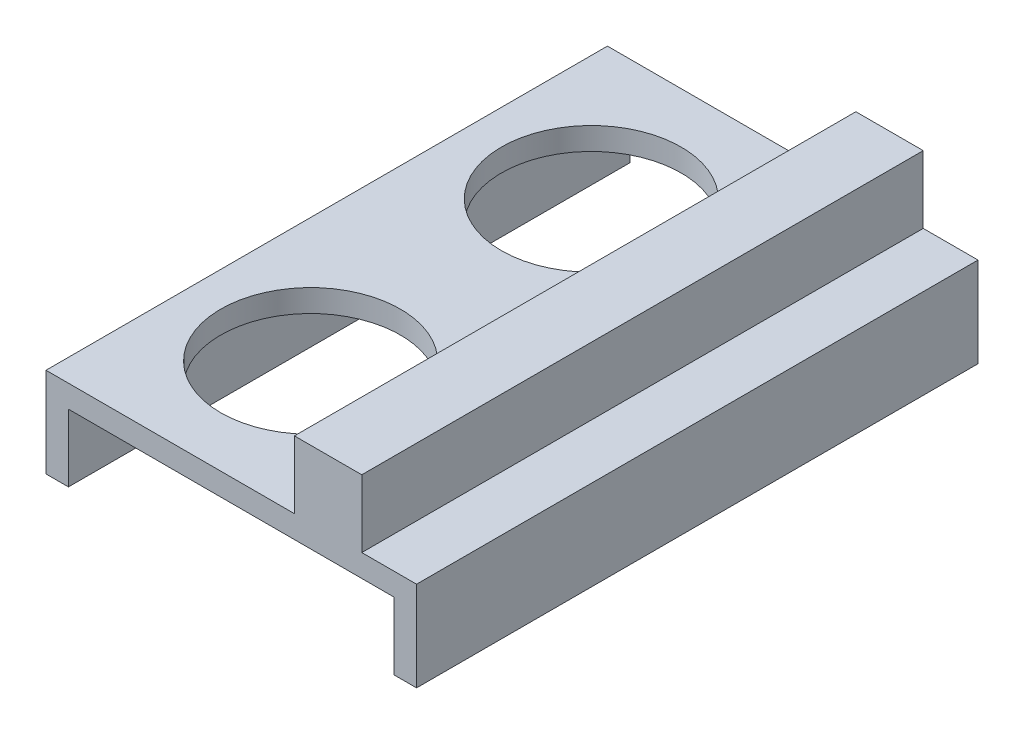
ISO-10303-21;
HEADER;
FILE_DESCRIPTION(('STEP AP214'),'2;1');
FILE_NAME('part.step','',(''),(''),'','','');
FILE_SCHEMA(('AUTOMOTIVE_DESIGN { 1 0 10303 214 1 1 1 1 }'));
ENDSEC;
DATA;
#1=APPLICATION_CONTEXT('core data for automotive mechanical design processes');
#2=APPLICATION_PROTOCOL_DEFINITION('international standard','automotive_design',2000,#1);
#3=PRODUCT_CONTEXT('',#1,'mechanical');
#4=PRODUCT('Part','Part','',(#3));
#5=PRODUCT_RELATED_PRODUCT_CATEGORY('part','',(#4));
#6=PRODUCT_DEFINITION_FORMATION('','',#4);
#7=PRODUCT_DEFINITION_CONTEXT('part definition',#1,'design');
#8=PRODUCT_DEFINITION('design','',#6,#7);
#9=PRODUCT_DEFINITION_SHAPE('','',#8);
#10=(LENGTH_UNIT() NAMED_UNIT(*) SI_UNIT(.MILLI.,.METRE.));
#11=(NAMED_UNIT(*) PLANE_ANGLE_UNIT() SI_UNIT($,.RADIAN.));
#12=(NAMED_UNIT(*) SI_UNIT($,.STERADIAN.) SOLID_ANGLE_UNIT());
#13=UNCERTAINTY_MEASURE_WITH_UNIT(LENGTH_MEASURE(1.E-05),#10,'distance_accuracy_value','');
#14=(GEOMETRIC_REPRESENTATION_CONTEXT(3) GLOBAL_UNCERTAINTY_ASSIGNED_CONTEXT((#13)) GLOBAL_UNIT_ASSIGNED_CONTEXT((#10,
#11,#12)) REPRESENTATION_CONTEXT('',''));
#15=CARTESIAN_POINT('',(0.,0.,0.));
#16=DIRECTION('',(0.,0.,1.));
#17=DIRECTION('',(1.,0.,0.));
#18=AXIS2_PLACEMENT_3D('',#15,#16,#17);
#19=CARTESIAN_POINT('',(0.,2.,0.));
#20=DIRECTION('',(0.,1.,0.));
#21=DIRECTION('',(0.,0.,1.));
#22=AXIS2_PLACEMENT_3D('',#19,#20,#21);
#23=PLANE('',#22);
#24=CARTESIAN_POINT('',(-18.5182803677125,2.,18.8646525737584));
#25=DIRECTION('',(0.,1.,0.));
#26=DIRECTION('',(0.,0.,1.));
#27=AXIS2_PLACEMENT_3D('',#24,#25,#26);
#28=CIRCLE('',#27,8.);
#29=CARTESIAN_POINT('',(-18.5182803677125,2.,26.8646525737584));
#30=VERTEX_POINT('',#29);
#31=EDGE_CURVE('E262',#30,#30,#28,.T.);
#32=ORIENTED_EDGE('',*,*,#31,.F.);
#33=EDGE_LOOP('',(#32));
#34=FACE_BOUND('',#33,.T.);
#35=CARTESIAN_POINT('',(-18.5182803677125,2.,-6.13534742624159));
#36=DIRECTION('',(0.,1.,0.));
#37=DIRECTION('',(0.,0.,1.));
#38=AXIS2_PLACEMENT_3D('',#35,#36,#37);
#39=CIRCLE('',#38,8.);
#40=CARTESIAN_POINT('',(-18.5182803677125,2.,1.86465257375841));
#41=VERTEX_POINT('',#40);
#42=EDGE_CURVE('E165',#41,#41,#39,.T.);
#43=ORIENTED_EDGE('',*,*,#42,.F.);
#44=EDGE_LOOP('',(#43));
#45=FACE_BOUND('',#44,.T.);
#46=DIRECTION('',(1.,0.,0.));
#47=VECTOR('',#46,1.);
#48=CARTESIAN_POINT('',(-29.5796723459835,2.,31.3646525737584));
#49=LINE('',#48,#47);
#50=CARTESIAN_POINT('',(-29.5796723459835,2.,31.3646525737584));
#51=VERTEX_POINT('',#50);
#52=CARTESIAN_POINT('',(-7.45688838944147,2.,31.3646525737584));
#53=VERTEX_POINT('',#52);
#54=EDGE_CURVE('E236',#51,#53,#49,.T.);
#55=ORIENTED_EDGE('',*,*,#54,.T.);
#56=DIRECTION('',(0.,0.,-1.));
#57=VECTOR('',#56,1.);
#58=CARTESIAN_POINT('',(-7.45688838944147,2.,0.));
#59=LINE('',#58,#57);
#60=CARTESIAN_POINT('',(-7.45688838944147,2.,-18.6353474262416));
#61=VERTEX_POINT('',#60);
#62=EDGE_CURVE('E141',#53,#61,#59,.T.);
#63=ORIENTED_EDGE('',*,*,#62,.T.);
#64=DIRECTION('',(-1.,0.,0.));
#65=VECTOR('',#64,1.);
#66=CARTESIAN_POINT('',(-29.5796723459836,2.,-18.6353474262416));
#67=LINE('',#66,#65);
#68=CARTESIAN_POINT('',(-29.5796723459836,2.,-18.6353474262416));
#69=VERTEX_POINT('',#68);
#70=EDGE_CURVE('E242',#61,#69,#67,.T.);
#71=ORIENTED_EDGE('',*,*,#70,.T.);
#72=DIRECTION('',(0.,0.,1.));
#73=VECTOR('',#72,1.);
#74=CARTESIAN_POINT('',(-29.5796723459836,2.,-18.6353474262416));
#75=LINE('',#74,#73);
#76=EDGE_CURVE('E230',#69,#51,#75,.T.);
#77=ORIENTED_EDGE('',*,*,#76,.T.);
#78=EDGE_LOOP('',(#55,#63,#71,#77));
#79=FACE_BOUND('',#78,.T.);
#80=ADVANCED_FACE('F41',(#34,#45,#79),#23,.T.);
#81=CARTESIAN_POINT('',(3.42032765401645,2.,-18.6353474262416));
#82=VERTEX_POINT('',#81);
#83=CARTESIAN_POINT('',(-1.45688838944147,2.,-18.6353474262416));
#84=VERTEX_POINT('',#83);
#85=EDGE_CURVE('E243',#82,#84,#67,.T.);
#86=ORIENTED_EDGE('',*,*,#85,.T.);
#87=DIRECTION('',(0.,0.,1.));
#88=VECTOR('',#87,1.);
#89=CARTESIAN_POINT('',(-1.45688838944147,2.,0.));
#90=LINE('',#89,#88);
#91=CARTESIAN_POINT('',(-1.45688838944148,2.,31.3646525737584));
#92=VERTEX_POINT('',#91);
#93=EDGE_CURVE('E160',#84,#92,#90,.T.);
#94=ORIENTED_EDGE('',*,*,#93,.T.);
#95=CARTESIAN_POINT('',(3.42032765401645,2.,31.3646525737584));
#96=VERTEX_POINT('',#95);
#97=EDGE_CURVE('E234',#92,#96,#49,.T.);
#98=ORIENTED_EDGE('',*,*,#97,.T.);
#99=DIRECTION('',(0.,0.,-1.));
#100=VECTOR('',#99,1.);
#101=CARTESIAN_POINT('',(3.42032765401645,2.,-18.6353474262416));
#102=LINE('',#101,#100);
#103=EDGE_CURVE('E239',#96,#82,#102,.T.);
#104=ORIENTED_EDGE('',*,*,#103,.T.);
#105=EDGE_LOOP('',(#86,#94,#98,#104));
#106=FACE_BOUND('',#105,.T.);
#107=ADVANCED_FACE('F280',(#106),#23,.T.);
#108=CARTESIAN_POINT('',(0.,0.,0.));
#109=DIRECTION('',(0.,1.,0.));
#110=DIRECTION('',(0.,0.,1.));
#111=AXIS2_PLACEMENT_3D('',#108,#109,#110);
#112=PLANE('',#111);
#113=CARTESIAN_POINT('',(-18.5182803677125,0.,18.8646525737584));
#114=DIRECTION('',(0.,1.,0.));
#115=DIRECTION('',(0.,0.,1.));
#116=AXIS2_PLACEMENT_3D('',#113,#114,#115);
#117=CIRCLE('',#116,8.);
#118=CARTESIAN_POINT('',(-18.5182803677125,0.,26.8646525737584));
#119=VERTEX_POINT('',#118);
#120=EDGE_CURVE('E45',#119,#119,#117,.T.);
#121=ORIENTED_EDGE('',*,*,#120,.T.);
#122=EDGE_LOOP('',(#121));
#123=FACE_BOUND('',#122,.T.);
#124=CARTESIAN_POINT('',(-18.5182803677125,0.,-6.13534742624159));
#125=DIRECTION('',(0.,1.,0.));
#126=DIRECTION('',(0.,0.,1.));
#127=AXIS2_PLACEMENT_3D('',#124,#125,#126);
#128=CIRCLE('',#127,8.);
#129=CARTESIAN_POINT('',(-18.5182803677125,0.,1.86465257375841));
#130=VERTEX_POINT('',#129);
#131=EDGE_CURVE('E259',#130,#130,#128,.T.);
#132=ORIENTED_EDGE('',*,*,#131,.T.);
#133=EDGE_LOOP('',(#132));
#134=FACE_BOUND('',#133,.T.);
#135=DIRECTION('',(0.,0.,-1.));
#136=VECTOR('',#135,1.);
#137=CARTESIAN_POINT('',(1.42032765401645,0.,31.3646525737584));
#138=LINE('',#137,#136);
#139=CARTESIAN_POINT('',(1.42032765401645,0.,31.3646525737584));
#140=VERTEX_POINT('',#139);
#141=CARTESIAN_POINT('',(1.42032765401645,0.,-18.6353474262416));
#142=VERTEX_POINT('',#141);
#143=EDGE_CURVE('E145',#140,#142,#138,.T.);
#144=ORIENTED_EDGE('',*,*,#143,.F.);
#145=DIRECTION('',(1.,0.,0.));
#146=VECTOR('',#145,1.);
#147=CARTESIAN_POINT('',(-29.5796723459835,0.,31.3646525737584));
#148=LINE('',#147,#146);
#149=CARTESIAN_POINT('',(-27.5796723459835,0.,31.3646525737584));
#150=VERTEX_POINT('',#149);
#151=EDGE_CURVE('E229',#150,#140,#148,.T.);
#152=ORIENTED_EDGE('',*,*,#151,.F.);
#153=DIRECTION('',(0.,0.,1.));
#154=VECTOR('',#153,1.);
#155=CARTESIAN_POINT('',(-27.5796723459835,0.,31.3646525737584));
#156=LINE('',#155,#154);
#157=CARTESIAN_POINT('',(-27.5796723459835,0.,-18.6353474262416));
#158=VERTEX_POINT('',#157);
#159=EDGE_CURVE('E203',#158,#150,#156,.T.);
#160=ORIENTED_EDGE('',*,*,#159,.F.);
#161=DIRECTION('',(-1.,0.,0.));
#162=VECTOR('',#161,1.);
#163=CARTESIAN_POINT('',(-29.5796723459836,0.,-18.6353474262416));
#164=LINE('',#163,#162);
#165=EDGE_CURVE('E235',#142,#158,#164,.T.);
#166=ORIENTED_EDGE('',*,*,#165,.F.);
#167=EDGE_LOOP('',(#144,#152,#160,#166));
#168=FACE_BOUND('',#167,.T.);
#169=ADVANCED_FACE('F306',(#123,#134,#168),#112,.F.);
#170=CARTESIAN_POINT('',(-29.5796723459836,2.,-18.6353474262416));
#171=DIRECTION('',(1.,0.,0.));
#172=DIRECTION('',(0.,0.,-1.));
#173=AXIS2_PLACEMENT_3D('',#170,#171,#172);
#174=PLANE('',#173);
#175=DIRECTION('',(0.,-1.,0.));
#176=VECTOR('',#175,1.);
#177=CARTESIAN_POINT('',(-29.5796723459836,2.,-18.6353474262416));
#178=LINE('',#177,#176);
#179=CARTESIAN_POINT('',(-29.5796723459835,-6.,-18.6353474262416));
#180=VERTEX_POINT('',#179);
#181=EDGE_CURVE('E247',#69,#180,#178,.T.);
#182=ORIENTED_EDGE('',*,*,#181,.T.);
#183=DIRECTION('',(0.,0.,-1.));
#184=VECTOR('',#183,1.);
#185=CARTESIAN_POINT('',(-29.5796723459835,-6.,31.3646525737584));
#186=LINE('',#185,#184);
#187=CARTESIAN_POINT('',(-29.5796723459835,-6.,31.3646525737584));
#188=VERTEX_POINT('',#187);
#189=EDGE_CURVE('E204',#188,#180,#186,.T.);
#190=ORIENTED_EDGE('',*,*,#189,.F.);
#191=DIRECTION('',(0.,-1.,0.));
#192=VECTOR('',#191,1.);
#193=CARTESIAN_POINT('',(-29.5796723459835,2.,31.3646525737584));
#194=LINE('',#193,#192);
#195=EDGE_CURVE('E11',#51,#188,#194,.T.);
#196=ORIENTED_EDGE('',*,*,#195,.F.);
#197=ORIENTED_EDGE('',*,*,#76,.F.);
#198=EDGE_LOOP('',(#182,#190,#196,#197));
#199=FACE_BOUND('',#198,.T.);
#200=ADVANCED_FACE('F43',(#199),#174,.F.);
#201=CARTESIAN_POINT('',(-29.5796723459835,2.,31.3646525737584));
#202=DIRECTION('',(0.,0.,-1.));
#203=DIRECTION('',(-1.,0.,0.));
#204=AXIS2_PLACEMENT_3D('',#201,#202,#203);
#205=PLANE('',#204);
#206=ORIENTED_EDGE('',*,*,#195,.T.);
#207=DIRECTION('',(-1.,0.,0.));
#208=VECTOR('',#207,1.);
#209=CARTESIAN_POINT('',(-29.5796723459835,-6.,31.3646525737584));
#210=LINE('',#209,#208);
#211=CARTESIAN_POINT('',(-27.5796723459835,-6.,31.3646525737584));
#212=VERTEX_POINT('',#211);
#213=EDGE_CURVE('E214',#212,#188,#210,.T.);
#214=ORIENTED_EDGE('',*,*,#213,.F.);
#215=DIRECTION('',(0.,1.,0.));
#216=VECTOR('',#215,1.);
#217=CARTESIAN_POINT('',(-27.5796723459835,-6.,31.3646525737584));
#218=LINE('',#217,#216);
#219=EDGE_CURVE('E218',#212,#150,#218,.T.);
#220=ORIENTED_EDGE('',*,*,#219,.T.);
#221=ORIENTED_EDGE('',*,*,#151,.T.);
#222=DIRECTION('',(0.,1.,0.));
#223=VECTOR('',#222,1.);
#224=CARTESIAN_POINT('',(1.42032765401645,-6.,31.3646525737584));
#225=LINE('',#224,#223);
#226=CARTESIAN_POINT('',(1.42032765401645,-6.,31.3646525737584));
#227=VERTEX_POINT('',#226);
#228=EDGE_CURVE('E200',#227,#140,#225,.T.);
#229=ORIENTED_EDGE('',*,*,#228,.F.);
#230=DIRECTION('',(-1.,0.,0.));
#231=VECTOR('',#230,1.);
#232=CARTESIAN_POINT('',(3.42032765401645,-6.,31.3646525737584));
#233=LINE('',#232,#231);
#234=CARTESIAN_POINT('',(3.42032765401645,-6.,31.3646525737584));
#235=VERTEX_POINT('',#234);
#236=EDGE_CURVE('E186',#235,#227,#233,.T.);
#237=ORIENTED_EDGE('',*,*,#236,.F.);
#238=DIRECTION('',(0.,-1.,0.));
#239=VECTOR('',#238,1.);
#240=CARTESIAN_POINT('',(3.42032765401645,2.,31.3646525737584));
#241=LINE('',#240,#239);
#242=EDGE_CURVE('E51',#96,#235,#241,.T.);
#243=ORIENTED_EDGE('',*,*,#242,.F.);
#244=ORIENTED_EDGE('',*,*,#97,.F.);
#245=DIRECTION('',(0.,-1.,0.));
#246=VECTOR('',#245,1.);
#247=CARTESIAN_POINT('',(-1.45688838944147,8.,31.3646525737584));
#248=LINE('',#247,#246);
#249=CARTESIAN_POINT('',(-1.45688838944147,8.,31.3646525737584));
#250=VERTEX_POINT('',#249);
#251=EDGE_CURVE('E59',#250,#92,#248,.T.);
#252=ORIENTED_EDGE('',*,*,#251,.F.);
#253=DIRECTION('',(1.,0.,0.));
#254=VECTOR('',#253,1.);
#255=CARTESIAN_POINT('',(0.,8.,31.3646525737584));
#256=LINE('',#255,#254);
#257=CARTESIAN_POINT('',(-7.45688838944147,8.,31.3646525737584));
#258=VERTEX_POINT('',#257);
#259=EDGE_CURVE('E147',#258,#250,#256,.T.);
#260=ORIENTED_EDGE('',*,*,#259,.F.);
#261=DIRECTION('',(0.,-1.,0.));
#262=VECTOR('',#261,1.);
#263=CARTESIAN_POINT('',(-7.45688838944147,8.,31.3646525737584));
#264=LINE('',#263,#262);
#265=EDGE_CURVE('E135',#258,#53,#264,.T.);
#266=ORIENTED_EDGE('',*,*,#265,.T.);
#267=ORIENTED_EDGE('',*,*,#54,.F.);
#268=EDGE_LOOP('',(#206,#214,#220,#221,#229,#237,#243,#244,#252,#260,#266,#267));
#269=FACE_BOUND('',#268,.T.);
#270=ADVANCED_FACE('F148',(#269),#205,.F.);
#271=CARTESIAN_POINT('',(3.42032765401645,2.,-18.6353474262416));
#272=DIRECTION('',(-1.,0.,0.));
#273=DIRECTION('',(0.,0.,1.));
#274=AXIS2_PLACEMENT_3D('',#271,#272,#273);
#275=PLANE('',#274);
#276=ORIENTED_EDGE('',*,*,#242,.T.);
#277=DIRECTION('',(0.,0.,1.));
#278=VECTOR('',#277,1.);
#279=CARTESIAN_POINT('',(3.42032765401645,-6.,31.3646525737584));
#280=LINE('',#279,#278);
#281=CARTESIAN_POINT('',(3.42032765401645,-6.,-18.6353474262416));
#282=VERTEX_POINT('',#281);
#283=EDGE_CURVE('E182',#282,#235,#280,.T.);
#284=ORIENTED_EDGE('',*,*,#283,.F.);
#285=DIRECTION('',(0.,-1.,0.));
#286=VECTOR('',#285,1.);
#287=CARTESIAN_POINT('',(3.42032765401645,2.,-18.6353474262416));
#288=LINE('',#287,#286);
#289=EDGE_CURVE('E255',#82,#282,#288,.T.);
#290=ORIENTED_EDGE('',*,*,#289,.F.);
#291=ORIENTED_EDGE('',*,*,#103,.F.);
#292=EDGE_LOOP('',(#276,#284,#290,#291));
#293=FACE_BOUND('',#292,.T.);
#294=ADVANCED_FACE('F316',(#293),#275,.F.);
#295=CARTESIAN_POINT('',(-29.5796723459836,2.,-18.6353474262416));
#296=DIRECTION('',(0.,0.,1.));
#297=DIRECTION('',(1.,0.,0.));
#298=AXIS2_PLACEMENT_3D('',#295,#296,#297);
#299=PLANE('',#298);
#300=ORIENTED_EDGE('',*,*,#289,.T.);
#301=DIRECTION('',(1.,0.,0.));
#302=VECTOR('',#301,1.);
#303=CARTESIAN_POINT('',(3.42032765401645,-6.,-18.6353474262416));
#304=LINE('',#303,#302);
#305=CARTESIAN_POINT('',(1.42032765401646,-6.,-18.6353474262416));
#306=VERTEX_POINT('',#305);
#307=EDGE_CURVE('E192',#306,#282,#304,.T.);
#308=ORIENTED_EDGE('',*,*,#307,.F.);
#309=DIRECTION('',(0.,1.,0.));
#310=VECTOR('',#309,1.);
#311=CARTESIAN_POINT('',(1.42032765401646,-6.,-18.6353474262416));
#312=LINE('',#311,#310);
#313=EDGE_CURVE('E67',#306,#142,#312,.T.);
#314=ORIENTED_EDGE('',*,*,#313,.T.);
#315=ORIENTED_EDGE('',*,*,#165,.T.);
#316=DIRECTION('',(0.,1.,0.));
#317=VECTOR('',#316,1.);
#318=CARTESIAN_POINT('',(-27.5796723459835,-6.,-18.6353474262416));
#319=LINE('',#318,#317);
#320=CARTESIAN_POINT('',(-27.5796723459835,-6.,-18.6353474262416));
#321=VERTEX_POINT('',#320);
#322=EDGE_CURVE('E225',#321,#158,#319,.T.);
#323=ORIENTED_EDGE('',*,*,#322,.F.);
#324=DIRECTION('',(1.,0.,0.));
#325=VECTOR('',#324,1.);
#326=CARTESIAN_POINT('',(-29.5796723459835,-6.,-18.6353474262416));
#327=LINE('',#326,#325);
#328=EDGE_CURVE('E208',#180,#321,#327,.T.);
#329=ORIENTED_EDGE('',*,*,#328,.F.);
#330=ORIENTED_EDGE('',*,*,#181,.F.);
#331=ORIENTED_EDGE('',*,*,#70,.F.);
#332=DIRECTION('',(0.,-1.,0.));
#333=VECTOR('',#332,1.);
#334=CARTESIAN_POINT('',(-7.45688838944147,8.,-18.6353474262416));
#335=LINE('',#334,#333);
#336=CARTESIAN_POINT('',(-7.45688838944147,8.,-18.6353474262416));
#337=VERTEX_POINT('',#336);
#338=EDGE_CURVE('E172',#337,#61,#335,.T.);
#339=ORIENTED_EDGE('',*,*,#338,.F.);
#340=DIRECTION('',(-1.,0.,0.));
#341=VECTOR('',#340,1.);
#342=CARTESIAN_POINT('',(0.,8.,-18.6353474262416));
#343=LINE('',#342,#341);
#344=CARTESIAN_POINT('',(-1.45688838944147,8.,-18.6353474262416));
#345=VERTEX_POINT('',#344);
#346=EDGE_CURVE('E157',#345,#337,#343,.T.);
#347=ORIENTED_EDGE('',*,*,#346,.F.);
#348=DIRECTION('',(0.,-1.,0.));
#349=VECTOR('',#348,1.);
#350=CARTESIAN_POINT('',(-1.45688838944147,8.,-18.6353474262416));
#351=LINE('',#350,#349);
#352=EDGE_CURVE('E177',#345,#84,#351,.T.);
#353=ORIENTED_EDGE('',*,*,#352,.T.);
#354=ORIENTED_EDGE('',*,*,#85,.F.);
#355=EDGE_LOOP('',(#300,#308,#314,#315,#323,#329,#330,#331,#339,#347,#353,#354));
#356=FACE_BOUND('',#355,.T.);
#357=ADVANCED_FACE('F296',(#356),#299,.F.);
#358=CARTESIAN_POINT('',(-27.5796723459835,-6.,31.3646525737584));
#359=DIRECTION('',(-1.,0.,0.));
#360=DIRECTION('',(0.,0.,1.));
#361=AXIS2_PLACEMENT_3D('',#358,#359,#360);
#362=PLANE('',#361);
#363=ORIENTED_EDGE('',*,*,#159,.T.);
#364=ORIENTED_EDGE('',*,*,#219,.F.);
#365=DIRECTION('',(0.,0.,1.));
#366=VECTOR('',#365,1.);
#367=CARTESIAN_POINT('',(-27.5796723459835,-6.,31.3646525737584));
#368=LINE('',#367,#366);
#369=EDGE_CURVE('E211',#321,#212,#368,.T.);
#370=ORIENTED_EDGE('',*,*,#369,.F.);
#371=ORIENTED_EDGE('',*,*,#322,.T.);
#372=EDGE_LOOP('',(#363,#364,#370,#371));
#373=FACE_BOUND('',#372,.T.);
#374=ADVANCED_FACE('F300',(#373),#362,.F.);
#375=CARTESIAN_POINT('',(0.,-6.,0.));
#376=DIRECTION('',(0.,-1.,0.));
#377=DIRECTION('',(0.,0.,-1.));
#378=AXIS2_PLACEMENT_3D('',#375,#376,#377);
#379=PLANE('',#378);
#380=ORIENTED_EDGE('',*,*,#189,.T.);
#381=ORIENTED_EDGE('',*,*,#328,.T.);
#382=ORIENTED_EDGE('',*,*,#369,.T.);
#383=ORIENTED_EDGE('',*,*,#213,.T.);
#384=EDGE_LOOP('',(#380,#381,#382,#383));
#385=FACE_BOUND('',#384,.T.);
#386=ADVANCED_FACE('F290',(#385),#379,.T.);
#387=CARTESIAN_POINT('',(1.42032765401645,-6.,31.3646525737584));
#388=DIRECTION('',(1.,0.,0.));
#389=DIRECTION('',(0.,0.,-1.));
#390=AXIS2_PLACEMENT_3D('',#387,#388,#389);
#391=PLANE('',#390);
#392=ORIENTED_EDGE('',*,*,#143,.T.);
#393=ORIENTED_EDGE('',*,*,#313,.F.);
#394=DIRECTION('',(0.,0.,-1.));
#395=VECTOR('',#394,1.);
#396=CARTESIAN_POINT('',(1.42032765401645,-6.,31.3646525737584));
#397=LINE('',#396,#395);
#398=EDGE_CURVE('E189',#227,#306,#397,.T.);
#399=ORIENTED_EDGE('',*,*,#398,.F.);
#400=ORIENTED_EDGE('',*,*,#228,.T.);
#401=EDGE_LOOP('',(#392,#393,#399,#400));
#402=FACE_BOUND('',#401,.T.);
#403=ADVANCED_FACE('F308',(#402),#391,.F.);
#404=CARTESIAN_POINT('',(0.,-6.,0.));
#405=DIRECTION('',(0.,1.,0.));
#406=DIRECTION('',(0.,0.,1.));
#407=AXIS2_PLACEMENT_3D('',#404,#405,#406);
#408=PLANE('',#407);
#409=ORIENTED_EDGE('',*,*,#283,.T.);
#410=ORIENTED_EDGE('',*,*,#236,.T.);
#411=ORIENTED_EDGE('',*,*,#398,.T.);
#412=ORIENTED_EDGE('',*,*,#307,.T.);
#413=EDGE_LOOP('',(#409,#410,#411,#412));
#414=FACE_BOUND('',#413,.T.);
#415=ADVANCED_FACE('F310',(#414),#408,.F.);
#416=CARTESIAN_POINT('',(-7.45688838944147,8.,0.));
#417=DIRECTION('',(-1.,0.,0.));
#418=DIRECTION('',(0.,0.,1.));
#419=AXIS2_PLACEMENT_3D('',#416,#417,#418);
#420=PLANE('',#419);
#421=ORIENTED_EDGE('',*,*,#62,.F.);
#422=ORIENTED_EDGE('',*,*,#265,.F.);
#423=DIRECTION('',(0.,0.,-1.));
#424=VECTOR('',#423,1.);
#425=CARTESIAN_POINT('',(-7.45688838944147,8.,0.));
#426=LINE('',#425,#424);
#427=EDGE_CURVE('E139',#258,#337,#426,.T.);
#428=ORIENTED_EDGE('',*,*,#427,.T.);
#429=ORIENTED_EDGE('',*,*,#338,.T.);
#430=EDGE_LOOP('',(#421,#422,#428,#429));
#431=FACE_BOUND('',#430,.T.);
#432=ADVANCED_FACE('F137',(#431),#420,.T.);
#433=CARTESIAN_POINT('',(-1.45688838944147,8.,0.));
#434=DIRECTION('',(1.,0.,0.));
#435=DIRECTION('',(0.,0.,-1.));
#436=AXIS2_PLACEMENT_3D('',#433,#434,#435);
#437=PLANE('',#436);
#438=ORIENTED_EDGE('',*,*,#93,.F.);
#439=ORIENTED_EDGE('',*,*,#352,.F.);
#440=DIRECTION('',(0.,0.,1.));
#441=VECTOR('',#440,1.);
#442=CARTESIAN_POINT('',(-1.45688838944147,8.,0.));
#443=LINE('',#442,#441);
#444=EDGE_CURVE('E153',#345,#250,#443,.T.);
#445=ORIENTED_EDGE('',*,*,#444,.T.);
#446=ORIENTED_EDGE('',*,*,#251,.T.);
#447=EDGE_LOOP('',(#438,#439,#445,#446));
#448=FACE_BOUND('',#447,.T.);
#449=ADVANCED_FACE('F321',(#448),#437,.T.);
#450=CARTESIAN_POINT('',(0.,8.,0.));
#451=DIRECTION('',(0.,1.,0.));
#452=DIRECTION('',(0.,0.,1.));
#453=AXIS2_PLACEMENT_3D('',#450,#451,#452);
#454=PLANE('',#453);
#455=ORIENTED_EDGE('',*,*,#427,.F.);
#456=ORIENTED_EDGE('',*,*,#259,.T.);
#457=ORIENTED_EDGE('',*,*,#444,.F.);
#458=ORIENTED_EDGE('',*,*,#346,.T.);
#459=EDGE_LOOP('',(#455,#456,#457,#458));
#460=FACE_BOUND('',#459,.T.);
#461=ADVANCED_FACE('F155',(#460),#454,.T.);
#462=CARTESIAN_POINT('',(-18.5182803677125,-4.,-6.13534742624159));
#463=DIRECTION('',(0.,1.,0.));
#464=DIRECTION('',(0.,0.,1.));
#465=AXIS2_PLACEMENT_3D('',#462,#463,#464);
#466=CYLINDRICAL_SURFACE('',#465,8.);
#467=ORIENTED_EDGE('',*,*,#42,.T.);
#468=EDGE_LOOP('',(#467));
#469=FACE_BOUND('',#468,.T.);
#470=ORIENTED_EDGE('',*,*,#131,.F.);
#471=EDGE_LOOP('',(#470));
#472=FACE_BOUND('',#471,.T.);
#473=ADVANCED_FACE('F275',(#469,#472),#466,.F.);
#474=CARTESIAN_POINT('',(-18.5182803677125,-4.,18.8646525737584));
#475=DIRECTION('',(0.,1.,0.));
#476=DIRECTION('',(0.,0.,1.));
#477=AXIS2_PLACEMENT_3D('',#474,#475,#476);
#478=CYLINDRICAL_SURFACE('',#477,8.);
#479=ORIENTED_EDGE('',*,*,#31,.T.);
#480=EDGE_LOOP('',(#479));
#481=FACE_BOUND('',#480,.T.);
#482=ORIENTED_EDGE('',*,*,#120,.F.);
#483=EDGE_LOOP('',(#482));
#484=FACE_BOUND('',#483,.T.);
#485=ADVANCED_FACE('F475',(#481,#484),#478,.F.);
#486=CLOSED_SHELL('',(#80,#107,#169,#200,#270,#294,#357,#374,#386,#403,#415,#432,#449,#461,#473,#485));
#487=MANIFOLD_SOLID_BREP('B2',#486);
#488=ADVANCED_BREP_SHAPE_REPRESENTATION('',(#18,#487),#14);
#489=SHAPE_DEFINITION_REPRESENTATION(#9,#488);
ENDSEC;
END-ISO-10303-21;
